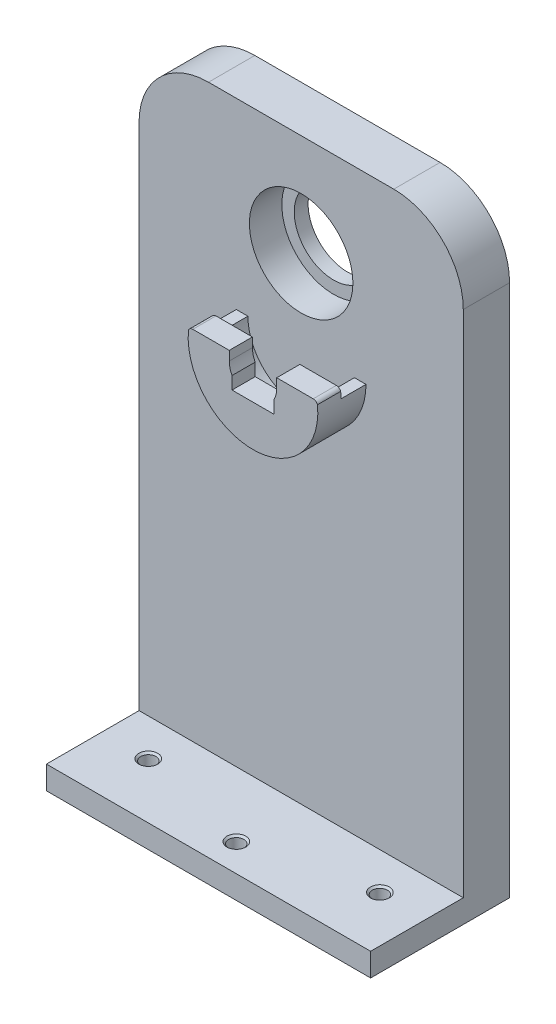
ISO-10303-21;
HEADER;
FILE_DESCRIPTION(('STEP AP214'),'2;1');
FILE_NAME('part.step','',(''),(''),'','','');
FILE_SCHEMA(('AUTOMOTIVE_DESIGN { 1 0 10303 214 1 1 1 1 }'));
ENDSEC;
DATA;
#1=APPLICATION_CONTEXT('core data for automotive mechanical design processes');
#2=APPLICATION_PROTOCOL_DEFINITION('international standard','automotive_design',2000,#1);
#3=PRODUCT_CONTEXT('',#1,'mechanical');
#4=PRODUCT('Part','Part','',(#3));
#5=PRODUCT_RELATED_PRODUCT_CATEGORY('part','',(#4));
#6=PRODUCT_DEFINITION_FORMATION('','',#4);
#7=PRODUCT_DEFINITION_CONTEXT('part definition',#1,'design');
#8=PRODUCT_DEFINITION('design','',#6,#7);
#9=PRODUCT_DEFINITION_SHAPE('','',#8);
#10=(LENGTH_UNIT() NAMED_UNIT(*) SI_UNIT(.MILLI.,.METRE.));
#11=(NAMED_UNIT(*) PLANE_ANGLE_UNIT() SI_UNIT($,.RADIAN.));
#12=(NAMED_UNIT(*) SI_UNIT($,.STERADIAN.) SOLID_ANGLE_UNIT());
#13=UNCERTAINTY_MEASURE_WITH_UNIT(LENGTH_MEASURE(1.E-05),#10,'distance_accuracy_value','');
#14=(GEOMETRIC_REPRESENTATION_CONTEXT(3) GLOBAL_UNCERTAINTY_ASSIGNED_CONTEXT((#13)) GLOBAL_UNIT_ASSIGNED_CONTEXT((#10,
#11,#12)) REPRESENTATION_CONTEXT('',''));
#15=CARTESIAN_POINT('',(0.,0.,0.));
#16=DIRECTION('',(0.,0.,1.));
#17=DIRECTION('',(1.,0.,0.));
#18=AXIS2_PLACEMENT_3D('',#15,#16,#17);
#19=CARTESIAN_POINT('',(-15.,115.,10.));
#20=DIRECTION('',(0.,0.,1.));
#21=DIRECTION('',(1.,0.,0.));
#22=AXIS2_PLACEMENT_3D('',#19,#20,#21);
#23=PLANE('',#22);
#24=CARTESIAN_POINT('',(-35.,108.,10.));
#25=DIRECTION('',(0.,0.,1.));
#26=DIRECTION('',(1.,0.,0.));
#27=AXIS2_PLACEMENT_3D('',#24,#25,#26);
#28=CIRCLE('',#27,11.175);
#29=CARTESIAN_POINT('',(-23.825,108.,10.));
#30=VERTEX_POINT('',#29);
#31=EDGE_CURVE('E420',#30,#30,#28,.T.);
#32=ORIENTED_EDGE('',*,*,#31,.F.);
#33=EDGE_LOOP('',(#32));
#34=FACE_BOUND('',#33,.T.);
#35=DIRECTION('',(-1.,0.,0.));
#36=VECTOR('',#35,1.);
#37=CARTESIAN_POINT('',(-70.,5.,10.));
#38=LINE('',#37,#36);
#39=CARTESIAN_POINT('',(0.,5.,10.));
#40=VERTEX_POINT('',#39);
#41=CARTESIAN_POINT('',(-70.,5.,10.));
#42=VERTEX_POINT('',#41);
#43=EDGE_CURVE('E394',#40,#42,#38,.T.);
#44=ORIENTED_EDGE('',*,*,#43,.F.);
#45=DIRECTION('',(0.,1.,0.));
#46=VECTOR('',#45,1.);
#47=CARTESIAN_POINT('',(0.,0.,10.));
#48=LINE('',#47,#46);
#49=CARTESIAN_POINT('',(0.,115.,10.));
#50=VERTEX_POINT('',#49);
#51=EDGE_CURVE('E434',#40,#50,#48,.T.);
#52=ORIENTED_EDGE('',*,*,#51,.T.);
#53=CARTESIAN_POINT('',(-15.,115.,10.));
#54=DIRECTION('',(0.,0.,1.));
#55=DIRECTION('',(1.,0.,0.));
#56=AXIS2_PLACEMENT_3D('',#53,#54,#55);
#57=CIRCLE('',#56,15.);
#58=CARTESIAN_POINT('',(-15.0000000000001,130.,10.));
#59=VERTEX_POINT('',#58);
#60=EDGE_CURVE('E437',#50,#59,#57,.T.);
#61=ORIENTED_EDGE('',*,*,#60,.T.);
#62=DIRECTION('',(-1.,0.,0.));
#63=VECTOR('',#62,1.);
#64=CARTESIAN_POINT('',(-15.0000000000001,130.,10.));
#65=LINE('',#64,#63);
#66=CARTESIAN_POINT('',(-54.9999999999999,130.,10.));
#67=VERTEX_POINT('',#66);
#68=EDGE_CURVE('E441',#59,#67,#65,.T.);
#69=ORIENTED_EDGE('',*,*,#68,.T.);
#70=CARTESIAN_POINT('',(-55.,115.,10.));
#71=DIRECTION('',(0.,0.,1.));
#72=DIRECTION('',(1.,0.,0.));
#73=AXIS2_PLACEMENT_3D('',#70,#71,#72);
#74=CIRCLE('',#73,15.);
#75=CARTESIAN_POINT('',(-70.,115.,10.));
#76=VERTEX_POINT('',#75);
#77=EDGE_CURVE('E444',#67,#76,#74,.T.);
#78=ORIENTED_EDGE('',*,*,#77,.T.);
#79=DIRECTION('',(0.,-1.,0.));
#80=VECTOR('',#79,1.);
#81=CARTESIAN_POINT('',(-70.,0.,10.));
#82=LINE('',#81,#80);
#83=EDGE_CURVE('E447',#76,#42,#82,.T.);
#84=ORIENTED_EDGE('',*,*,#83,.T.);
#85=EDGE_LOOP('',(#44,#52,#61,#69,#78,#84));
#86=FACE_BOUND('',#85,.T.);
#87=DIRECTION('',(1.,0.,0.));
#88=VECTOR('',#87,1.);
#89=CARTESIAN_POINT('',(0.,90.5,10.));
#90=LINE('',#89,#88);
#91=CARTESIAN_POINT('',(-49.,90.5,10.));
#92=VERTEX_POINT('',#91);
#93=CARTESIAN_POINT('',(-46.5,90.5,10.));
#94=VERTEX_POINT('',#93);
#95=EDGE_CURVE('E222',#92,#94,#90,.T.);
#96=ORIENTED_EDGE('',*,*,#95,.T.);
#97=CARTESIAN_POINT('',(-35.,90.5,10.));
#98=DIRECTION('',(0.,0.,1.));
#99=DIRECTION('',(1.,0.,0.));
#100=AXIS2_PLACEMENT_3D('',#97,#98,#99);
#101=CIRCLE('',#100,11.5);
#102=CARTESIAN_POINT('',(-23.5,90.5,10.));
#103=VERTEX_POINT('',#102);
#104=EDGE_CURVE('E357',#94,#103,#101,.T.);
#105=ORIENTED_EDGE('',*,*,#104,.T.);
#106=CARTESIAN_POINT('',(-21.,90.5,10.));
#107=VERTEX_POINT('',#106);
#108=EDGE_CURVE('E71',#103,#107,#90,.T.);
#109=ORIENTED_EDGE('',*,*,#108,.T.);
#110=CARTESIAN_POINT('',(-35.,90.5,10.));
#111=DIRECTION('',(0.,0.,1.));
#112=DIRECTION('',(1.,0.,0.));
#113=AXIS2_PLACEMENT_3D('',#110,#111,#112);
#114=CIRCLE('',#113,14.);
#115=EDGE_CURVE('E66',#92,#107,#114,.T.);
#116=ORIENTED_EDGE('',*,*,#115,.F.);
#117=EDGE_LOOP('',(#96,#105,#109,#116));
#118=FACE_BOUND('',#117,.T.);
#119=ADVANCED_FACE('F49',(#34,#86,#118),#23,.T.);
#120=CARTESIAN_POINT('',(-35.,108.,10.));
#121=DIRECTION('',(0.,0.,-1.));
#122=DIRECTION('',(-1.,0.,0.));
#123=AXIS2_PLACEMENT_3D('',#120,#121,#122);
#124=CYLINDRICAL_SURFACE('',#123,8.5);
#125=CARTESIAN_POINT('',(-35.,108.,0.));
#126=DIRECTION('',(0.,0.,1.));
#127=DIRECTION('',(1.,0.,0.));
#128=AXIS2_PLACEMENT_3D('',#125,#126,#127);
#129=CIRCLE('',#128,8.5);
#130=CARTESIAN_POINT('',(-26.5,108.,0.));
#131=VERTEX_POINT('',#130);
#132=EDGE_CURVE('E429',#131,#131,#129,.T.);
#133=ORIENTED_EDGE('',*,*,#132,.F.);
#134=EDGE_LOOP('',(#133));
#135=FACE_BOUND('',#134,.T.);
#136=CARTESIAN_POINT('',(-35.,108.,3.));
#137=DIRECTION('',(0.,0.,1.));
#138=DIRECTION('',(1.,0.,0.));
#139=AXIS2_PLACEMENT_3D('',#136,#137,#138);
#140=CIRCLE('',#139,8.5);
#141=CARTESIAN_POINT('',(-26.5,108.,3.));
#142=VERTEX_POINT('',#141);
#143=EDGE_CURVE('E425',#142,#142,#140,.T.);
#144=ORIENTED_EDGE('',*,*,#143,.T.);
#145=EDGE_LOOP('',(#144));
#146=FACE_BOUND('',#145,.T.);
#147=ADVANCED_FACE('F573',(#135,#146),#124,.F.);
#148=CARTESIAN_POINT('',(-15.,115.,0.));
#149=DIRECTION('',(0.,0.,1.));
#150=DIRECTION('',(1.,0.,0.));
#151=AXIS2_PLACEMENT_3D('',#148,#149,#150);
#152=PLANE('',#151);
#153=DIRECTION('',(0.,1.,0.));
#154=VECTOR('',#153,1.);
#155=CARTESIAN_POINT('',(0.,0.,0.));
#156=LINE('',#155,#154);
#157=CARTESIAN_POINT('',(0.,0.,0.));
#158=VERTEX_POINT('',#157);
#159=CARTESIAN_POINT('',(0.,115.,0.));
#160=VERTEX_POINT('',#159);
#161=EDGE_CURVE('E433',#158,#160,#156,.T.);
#162=ORIENTED_EDGE('',*,*,#161,.F.);
#163=DIRECTION('',(1.,0.,0.));
#164=VECTOR('',#163,1.);
#165=CARTESIAN_POINT('',(0.,0.,0.));
#166=LINE('',#165,#164);
#167=CARTESIAN_POINT('',(-70.,0.,0.));
#168=VERTEX_POINT('',#167);
#169=EDGE_CURVE('E438',#168,#158,#166,.T.);
#170=ORIENTED_EDGE('',*,*,#169,.F.);
#171=DIRECTION('',(0.,-1.,0.));
#172=VECTOR('',#171,1.);
#173=CARTESIAN_POINT('',(-70.,0.,0.));
#174=LINE('',#173,#172);
#175=CARTESIAN_POINT('',(-70.,115.,0.));
#176=VERTEX_POINT('',#175);
#177=EDGE_CURVE('E463',#176,#168,#174,.T.);
#178=ORIENTED_EDGE('',*,*,#177,.F.);
#179=CARTESIAN_POINT('',(-55.,115.,0.));
#180=DIRECTION('',(0.,0.,1.));
#181=DIRECTION('',(1.,0.,0.));
#182=AXIS2_PLACEMENT_3D('',#179,#180,#181);
#183=CIRCLE('',#182,15.);
#184=CARTESIAN_POINT('',(-54.9999999999999,130.,0.));
#185=VERTEX_POINT('',#184);
#186=EDGE_CURVE('E460',#185,#176,#183,.T.);
#187=ORIENTED_EDGE('',*,*,#186,.F.);
#188=DIRECTION('',(-1.,0.,0.));
#189=VECTOR('',#188,1.);
#190=CARTESIAN_POINT('',(-15.0000000000001,130.,0.));
#191=LINE('',#190,#189);
#192=CARTESIAN_POINT('',(-15.0000000000001,130.,0.));
#193=VERTEX_POINT('',#192);
#194=EDGE_CURVE('E457',#193,#185,#191,.T.);
#195=ORIENTED_EDGE('',*,*,#194,.F.);
#196=CARTESIAN_POINT('',(-15.,115.,0.));
#197=DIRECTION('',(0.,0.,1.));
#198=DIRECTION('',(1.,0.,0.));
#199=AXIS2_PLACEMENT_3D('',#196,#197,#198);
#200=CIRCLE('',#199,15.);
#201=EDGE_CURVE('E454',#160,#193,#200,.T.);
#202=ORIENTED_EDGE('',*,*,#201,.F.);
#203=EDGE_LOOP('',(#162,#170,#178,#187,#195,#202));
#204=FACE_BOUND('',#203,.T.);
#205=ORIENTED_EDGE('',*,*,#132,.T.);
#206=EDGE_LOOP('',(#205));
#207=FACE_BOUND('',#206,.T.);
#208=ADVANCED_FACE('F547',(#204,#207),#152,.F.);
#209=CARTESIAN_POINT('',(0.,0.,10.));
#210=DIRECTION('',(-1.,0.,0.));
#211=DIRECTION('',(0.,0.,1.));
#212=AXIS2_PLACEMENT_3D('',#209,#210,#211);
#213=PLANE('',#212);
#214=ORIENTED_EDGE('',*,*,#161,.T.);
#215=DIRECTION('',(0.,0.,-1.));
#216=VECTOR('',#215,1.);
#217=CARTESIAN_POINT('',(0.,115.,10.));
#218=LINE('',#217,#216);
#219=EDGE_CURVE('E487',#50,#160,#218,.T.);
#220=ORIENTED_EDGE('',*,*,#219,.F.);
#221=ORIENTED_EDGE('',*,*,#51,.F.);
#222=DIRECTION('',(0.,0.,-1.));
#223=VECTOR('',#222,1.);
#224=CARTESIAN_POINT('',(0.,5.,30.));
#225=LINE('',#224,#223);
#226=CARTESIAN_POINT('',(0.,5.,30.));
#227=VERTEX_POINT('',#226);
#228=EDGE_CURVE('E416',#227,#40,#225,.T.);
#229=ORIENTED_EDGE('',*,*,#228,.F.);
#230=DIRECTION('',(0.,1.,0.));
#231=VECTOR('',#230,1.);
#232=CARTESIAN_POINT('',(0.,0.,30.));
#233=LINE('',#232,#231);
#234=CARTESIAN_POINT('',(0.,0.,30.));
#235=VERTEX_POINT('',#234);
#236=EDGE_CURVE('E403',#235,#227,#233,.T.);
#237=ORIENTED_EDGE('',*,*,#236,.F.);
#238=DIRECTION('',(0.,0.,-1.));
#239=VECTOR('',#238,1.);
#240=CARTESIAN_POINT('',(0.,0.,10.));
#241=LINE('',#240,#239);
#242=EDGE_CURVE('E450',#235,#158,#241,.T.);
#243=ORIENTED_EDGE('',*,*,#242,.T.);
#244=EDGE_LOOP('',(#214,#220,#221,#229,#237,#243));
#245=FACE_BOUND('',#244,.T.);
#246=ADVANCED_FACE('F544',(#245),#213,.F.);
#247=CARTESIAN_POINT('',(-15.,115.,10.));
#248=DIRECTION('',(0.,0.,-1.));
#249=DIRECTION('',(-1.,0.,0.));
#250=AXIS2_PLACEMENT_3D('',#247,#248,#249);
#251=CYLINDRICAL_SURFACE('',#250,15.);
#252=ORIENTED_EDGE('',*,*,#201,.T.);
#253=DIRECTION('',(0.,0.,-1.));
#254=VECTOR('',#253,1.);
#255=CARTESIAN_POINT('',(-15.0000000000001,130.,10.));
#256=LINE('',#255,#254);
#257=EDGE_CURVE('E483',#59,#193,#256,.T.);
#258=ORIENTED_EDGE('',*,*,#257,.F.);
#259=ORIENTED_EDGE('',*,*,#60,.F.);
#260=ORIENTED_EDGE('',*,*,#219,.T.);
#261=EDGE_LOOP('',(#252,#258,#259,#260));
#262=FACE_BOUND('',#261,.T.);
#263=ADVANCED_FACE('F554',(#262),#251,.T.);
#264=CARTESIAN_POINT('',(-15.0000000000001,130.,10.));
#265=DIRECTION('',(0.,-1.,0.));
#266=DIRECTION('',(1.,0.,0.));
#267=AXIS2_PLACEMENT_3D('',#264,#265,#266);
#268=PLANE('',#267);
#269=ORIENTED_EDGE('',*,*,#194,.T.);
#270=DIRECTION('',(0.,0.,-1.));
#271=VECTOR('',#270,1.);
#272=CARTESIAN_POINT('',(-54.9999999999999,130.,10.));
#273=LINE('',#272,#271);
#274=EDGE_CURVE('E479',#67,#185,#273,.T.);
#275=ORIENTED_EDGE('',*,*,#274,.F.);
#276=ORIENTED_EDGE('',*,*,#68,.F.);
#277=ORIENTED_EDGE('',*,*,#257,.T.);
#278=EDGE_LOOP('',(#269,#275,#276,#277));
#279=FACE_BOUND('',#278,.T.);
#280=ADVANCED_FACE('F571',(#279),#268,.F.);
#281=CARTESIAN_POINT('',(-55.,115.,10.));
#282=DIRECTION('',(0.,0.,-1.));
#283=DIRECTION('',(-1.,0.,0.));
#284=AXIS2_PLACEMENT_3D('',#281,#282,#283);
#285=CYLINDRICAL_SURFACE('',#284,15.);
#286=ORIENTED_EDGE('',*,*,#186,.T.);
#287=DIRECTION('',(0.,0.,-1.));
#288=VECTOR('',#287,1.);
#289=CARTESIAN_POINT('',(-70.,115.,10.));
#290=LINE('',#289,#288);
#291=EDGE_CURVE('E475',#76,#176,#290,.T.);
#292=ORIENTED_EDGE('',*,*,#291,.F.);
#293=ORIENTED_EDGE('',*,*,#77,.F.);
#294=ORIENTED_EDGE('',*,*,#274,.T.);
#295=EDGE_LOOP('',(#286,#292,#293,#294));
#296=FACE_BOUND('',#295,.T.);
#297=ADVANCED_FACE('F566',(#296),#285,.T.);
#298=CARTESIAN_POINT('',(-70.,0.,10.));
#299=DIRECTION('',(1.,0.,0.));
#300=DIRECTION('',(0.,0.,-1.));
#301=AXIS2_PLACEMENT_3D('',#298,#299,#300);
#302=PLANE('',#301);
#303=ORIENTED_EDGE('',*,*,#177,.T.);
#304=DIRECTION('',(0.,0.,-1.));
#305=VECTOR('',#304,1.);
#306=CARTESIAN_POINT('',(-70.,0.,10.));
#307=LINE('',#306,#305);
#308=CARTESIAN_POINT('',(-70.,0.,30.));
#309=VERTEX_POINT('',#308);
#310=EDGE_CURVE('E471',#309,#168,#307,.T.);
#311=ORIENTED_EDGE('',*,*,#310,.F.);
#312=DIRECTION('',(0.,-1.,0.));
#313=VECTOR('',#312,1.);
#314=CARTESIAN_POINT('',(-70.,0.,30.));
#315=LINE('',#314,#313);
#316=CARTESIAN_POINT('',(-70.,5.,30.));
#317=VERTEX_POINT('',#316);
#318=EDGE_CURVE('E395',#317,#309,#315,.T.);
#319=ORIENTED_EDGE('',*,*,#318,.F.);
#320=DIRECTION('',(0.,0.,-1.));
#321=VECTOR('',#320,1.);
#322=CARTESIAN_POINT('',(-70.,5.,30.));
#323=LINE('',#322,#321);
#324=EDGE_CURVE('E409',#317,#42,#323,.T.);
#325=ORIENTED_EDGE('',*,*,#324,.T.);
#326=ORIENTED_EDGE('',*,*,#83,.F.);
#327=ORIENTED_EDGE('',*,*,#291,.T.);
#328=EDGE_LOOP('',(#303,#311,#319,#325,#326,#327));
#329=FACE_BOUND('',#328,.T.);
#330=ADVANCED_FACE('F534',(#329),#302,.F.);
#331=CARTESIAN_POINT('',(0.,0.,10.));
#332=DIRECTION('',(0.,1.,0.));
#333=DIRECTION('',(-1.,0.,0.));
#334=AXIS2_PLACEMENT_3D('',#331,#332,#333);
#335=PLANE('',#334);
#336=CARTESIAN_POINT('',(-60.,0.,18.));
#337=DIRECTION('',(0.,1.,0.));
#338=DIRECTION('',(-1.,0.,0.));
#339=AXIS2_PLACEMENT_3D('',#336,#337,#338);
#340=CIRCLE('',#339,1.64000000000001);
#341=CARTESIAN_POINT('',(-61.64,0.,18.));
#342=VERTEX_POINT('',#341);
#343=EDGE_CURVE('E390',#342,#342,#340,.T.);
#344=ORIENTED_EDGE('',*,*,#343,.T.);
#345=EDGE_LOOP('',(#344));
#346=FACE_BOUND('',#345,.T.);
#347=CARTESIAN_POINT('',(-35.,0.,24.));
#348=DIRECTION('',(0.,1.,0.));
#349=DIRECTION('',(-1.,0.,0.));
#350=AXIS2_PLACEMENT_3D('',#347,#348,#349);
#351=CIRCLE('',#350,1.64000000000001);
#352=CARTESIAN_POINT('',(-36.64,0.,24.));
#353=VERTEX_POINT('',#352);
#354=EDGE_CURVE('E386',#353,#353,#351,.T.);
#355=ORIENTED_EDGE('',*,*,#354,.T.);
#356=EDGE_LOOP('',(#355));
#357=FACE_BOUND('',#356,.T.);
#358=CARTESIAN_POINT('',(-10.,0.,18.));
#359=DIRECTION('',(0.,1.,0.));
#360=DIRECTION('',(-1.,0.,0.));
#361=AXIS2_PLACEMENT_3D('',#358,#359,#360);
#362=CIRCLE('',#361,1.64);
#363=CARTESIAN_POINT('',(-11.64,0.,18.));
#364=VERTEX_POINT('',#363);
#365=EDGE_CURVE('E382',#364,#364,#362,.T.);
#366=ORIENTED_EDGE('',*,*,#365,.T.);
#367=EDGE_LOOP('',(#366));
#368=FACE_BOUND('',#367,.T.);
#369=ORIENTED_EDGE('',*,*,#169,.T.);
#370=ORIENTED_EDGE('',*,*,#242,.F.);
#371=DIRECTION('',(1.,0.,0.));
#372=VECTOR('',#371,1.);
#373=CARTESIAN_POINT('',(-70.,0.,30.));
#374=LINE('',#373,#372);
#375=EDGE_CURVE('E399',#309,#235,#374,.T.);
#376=ORIENTED_EDGE('',*,*,#375,.F.);
#377=ORIENTED_EDGE('',*,*,#310,.T.);
#378=EDGE_LOOP('',(#369,#370,#376,#377));
#379=FACE_BOUND('',#378,.T.);
#380=ADVANCED_FACE('F530',(#346,#357,#368,#379),#335,.F.);
#381=CARTESIAN_POINT('',(-35.,108.,3.));
#382=DIRECTION('',(0.,0.,1.));
#383=DIRECTION('',(1.,0.,0.));
#384=AXIS2_PLACEMENT_3D('',#381,#382,#383);
#385=CYLINDRICAL_SURFACE('',#384,11.175);
#386=CARTESIAN_POINT('',(-35.,108.,3.));
#387=DIRECTION('',(0.,0.,1.));
#388=DIRECTION('',(1.,0.,0.));
#389=AXIS2_PLACEMENT_3D('',#386,#387,#388);
#390=CIRCLE('',#389,11.175);
#391=CARTESIAN_POINT('',(-23.825,108.,3.));
#392=VERTEX_POINT('',#391);
#393=EDGE_CURVE('E421',#392,#392,#390,.T.);
#394=ORIENTED_EDGE('',*,*,#393,.F.);
#395=EDGE_LOOP('',(#394));
#396=FACE_BOUND('',#395,.T.);
#397=ORIENTED_EDGE('',*,*,#31,.T.);
#398=EDGE_LOOP('',(#397));
#399=FACE_BOUND('',#398,.T.);
#400=ADVANCED_FACE('F533',(#396,#399),#385,.F.);
#401=CARTESIAN_POINT('',(-35.,108.,3.));
#402=DIRECTION('',(0.,0.,1.));
#403=DIRECTION('',(1.,0.,0.));
#404=AXIS2_PLACEMENT_3D('',#401,#402,#403);
#405=PLANE('',#404);
#406=ORIENTED_EDGE('',*,*,#143,.F.);
#407=EDGE_LOOP('',(#406));
#408=FACE_BOUND('',#407,.T.);
#409=ORIENTED_EDGE('',*,*,#393,.T.);
#410=EDGE_LOOP('',(#409));
#411=FACE_BOUND('',#410,.T.);
#412=ADVANCED_FACE('F663',(#408,#411),#405,.T.);
#413=CARTESIAN_POINT('',(-70.,5.,30.));
#414=DIRECTION('',(0.,-1.,0.));
#415=DIRECTION('',(0.,0.,-1.));
#416=AXIS2_PLACEMENT_3D('',#413,#414,#415);
#417=PLANE('',#416);
#418=CARTESIAN_POINT('',(-10.,5.,18.));
#419=DIRECTION('',(0.,-1.,0.));
#420=DIRECTION('',(0.,0.,-1.));
#421=AXIS2_PLACEMENT_3D('',#418,#419,#420);
#422=CIRCLE('',#421,2.04);
#423=CARTESIAN_POINT('',(-10.,5.,15.96));
#424=VERTEX_POINT('',#423);
#425=EDGE_CURVE('E59',#424,#424,#422,.T.);
#426=ORIENTED_EDGE('',*,*,#425,.T.);
#427=EDGE_LOOP('',(#426));
#428=FACE_BOUND('',#427,.T.);
#429=CARTESIAN_POINT('',(-60.,5.,18.));
#430=DIRECTION('',(0.,-1.,0.));
#431=DIRECTION('',(0.,0.,-1.));
#432=AXIS2_PLACEMENT_3D('',#429,#430,#431);
#433=CIRCLE('',#432,2.04);
#434=CARTESIAN_POINT('',(-60.,5.,15.96));
#435=VERTEX_POINT('',#434);
#436=EDGE_CURVE('E506',#435,#435,#433,.T.);
#437=ORIENTED_EDGE('',*,*,#436,.T.);
#438=EDGE_LOOP('',(#437));
#439=FACE_BOUND('',#438,.T.);
#440=CARTESIAN_POINT('',(-35.,5.,24.));
#441=DIRECTION('',(0.,-1.,0.));
#442=DIRECTION('',(0.,0.,-1.));
#443=AXIS2_PLACEMENT_3D('',#440,#441,#442);
#444=CIRCLE('',#443,2.04);
#445=CARTESIAN_POINT('',(-35.,5.,21.96));
#446=VERTEX_POINT('',#445);
#447=EDGE_CURVE('E498',#446,#446,#444,.T.);
#448=ORIENTED_EDGE('',*,*,#447,.T.);
#449=EDGE_LOOP('',(#448));
#450=FACE_BOUND('',#449,.T.);
#451=ORIENTED_EDGE('',*,*,#43,.T.);
#452=ORIENTED_EDGE('',*,*,#324,.F.);
#453=DIRECTION('',(-1.,0.,0.));
#454=VECTOR('',#453,1.);
#455=CARTESIAN_POINT('',(-70.,5.,30.));
#456=LINE('',#455,#454);
#457=EDGE_CURVE('E406',#227,#317,#456,.T.);
#458=ORIENTED_EDGE('',*,*,#457,.F.);
#459=ORIENTED_EDGE('',*,*,#228,.T.);
#460=EDGE_LOOP('',(#451,#452,#458,#459));
#461=FACE_BOUND('',#460,.T.);
#462=ADVANCED_FACE('F513',(#428,#439,#450,#461),#417,.F.);
#463=CARTESIAN_POINT('',(0.,0.,30.));
#464=DIRECTION('',(0.,0.,-1.));
#465=DIRECTION('',(-1.,0.,0.));
#466=AXIS2_PLACEMENT_3D('',#463,#464,#465);
#467=PLANE('',#466);
#468=ORIENTED_EDGE('',*,*,#318,.T.);
#469=ORIENTED_EDGE('',*,*,#375,.T.);
#470=ORIENTED_EDGE('',*,*,#236,.T.);
#471=ORIENTED_EDGE('',*,*,#457,.T.);
#472=EDGE_LOOP('',(#468,#469,#470,#471));
#473=FACE_BOUND('',#472,.T.);
#474=ADVANCED_FACE('F526',(#473),#467,.F.);
#475=CARTESIAN_POINT('',(-10.,-15.,18.));
#476=DIRECTION('',(0.,1.,0.));
#477=DIRECTION('',(0.,0.,1.));
#478=AXIS2_PLACEMENT_3D('',#475,#476,#477);
#479=CYLINDRICAL_SURFACE('',#478,1.64);
#480=CARTESIAN_POINT('',(-10.,4.60000000000001,18.));
#481=DIRECTION('',(0.,-1.,0.));
#482=DIRECTION('',(0.,0.,-1.));
#483=AXIS2_PLACEMENT_3D('',#480,#481,#482);
#484=CIRCLE('',#483,1.64);
#485=CARTESIAN_POINT('',(-10.,4.60000000000001,16.36));
#486=VERTEX_POINT('',#485);
#487=EDGE_CURVE('E502',#486,#486,#484,.F.);
#488=ORIENTED_EDGE('',*,*,#487,.T.);
#489=EDGE_LOOP('',(#488));
#490=FACE_BOUND('',#489,.T.);
#491=ORIENTED_EDGE('',*,*,#365,.F.);
#492=EDGE_LOOP('',(#491));
#493=FACE_BOUND('',#492,.T.);
#494=ADVANCED_FACE('F522',(#490,#493),#479,.F.);
#495=CARTESIAN_POINT('',(-35.,-15.,24.));
#496=DIRECTION('',(0.,1.,0.));
#497=DIRECTION('',(0.,0.,1.));
#498=AXIS2_PLACEMENT_3D('',#495,#496,#497);
#499=CYLINDRICAL_SURFACE('',#498,1.64000000000001);
#500=CARTESIAN_POINT('',(-35.,4.60000000000001,24.));
#501=DIRECTION('',(0.,-1.,0.));
#502=DIRECTION('',(0.,0.,-1.));
#503=AXIS2_PLACEMENT_3D('',#500,#501,#502);
#504=CIRCLE('',#503,1.64000000000001);
#505=CARTESIAN_POINT('',(-35.,4.60000000000001,22.36));
#506=VERTEX_POINT('',#505);
#507=EDGE_CURVE('E491',#506,#506,#504,.F.);
#508=ORIENTED_EDGE('',*,*,#507,.T.);
#509=EDGE_LOOP('',(#508));
#510=FACE_BOUND('',#509,.T.);
#511=ORIENTED_EDGE('',*,*,#354,.F.);
#512=EDGE_LOOP('',(#511));
#513=FACE_BOUND('',#512,.T.);
#514=ADVANCED_FACE('F525',(#510,#513),#499,.F.);
#515=CARTESIAN_POINT('',(-60.,-15.,18.));
#516=DIRECTION('',(0.,1.,0.));
#517=DIRECTION('',(0.,0.,1.));
#518=AXIS2_PLACEMENT_3D('',#515,#516,#517);
#519=CYLINDRICAL_SURFACE('',#518,1.64000000000001);
#520=CARTESIAN_POINT('',(-60.,4.60000000000001,18.));
#521=DIRECTION('',(0.,-1.,0.));
#522=DIRECTION('',(0.,0.,-1.));
#523=AXIS2_PLACEMENT_3D('',#520,#521,#522);
#524=CIRCLE('',#523,1.64000000000001);
#525=CARTESIAN_POINT('',(-60.,4.60000000000001,16.36));
#526=VERTEX_POINT('',#525);
#527=EDGE_CURVE('E11',#526,#526,#524,.F.);
#528=ORIENTED_EDGE('',*,*,#527,.T.);
#529=EDGE_LOOP('',(#528));
#530=FACE_BOUND('',#529,.T.);
#531=ORIENTED_EDGE('',*,*,#343,.F.);
#532=EDGE_LOOP('',(#531));
#533=FACE_BOUND('',#532,.T.);
#534=ADVANCED_FACE('F652',(#530,#533),#519,.F.);
#535=CARTESIAN_POINT('',(-35.,4.60000000000001,24.));
#536=DIRECTION('',(0.,1.,0.));
#537=DIRECTION('',(0.,0.,1.));
#538=AXIS2_PLACEMENT_3D('',#535,#536,#537);
#539=CONICAL_SURFACE('',#538,1.64000000000001,0.785398163397453);
#540=ORIENTED_EDGE('',*,*,#447,.F.);
#541=EDGE_LOOP('',(#540));
#542=FACE_BOUND('',#541,.T.);
#543=ORIENTED_EDGE('',*,*,#507,.F.);
#544=EDGE_LOOP('',(#543));
#545=FACE_BOUND('',#544,.T.);
#546=ADVANCED_FACE('F519',(#542,#545),#539,.F.);
#547=CARTESIAN_POINT('',(-10.,4.60000000000001,18.));
#548=DIRECTION('',(0.,1.,0.));
#549=DIRECTION('',(0.,0.,1.));
#550=AXIS2_PLACEMENT_3D('',#547,#548,#549);
#551=CONICAL_SURFACE('',#550,1.64,0.785398163397457);
#552=ORIENTED_EDGE('',*,*,#425,.F.);
#553=EDGE_LOOP('',(#552));
#554=FACE_BOUND('',#553,.T.);
#555=ORIENTED_EDGE('',*,*,#487,.F.);
#556=EDGE_LOOP('',(#555));
#557=FACE_BOUND('',#556,.T.);
#558=ADVANCED_FACE('F516',(#554,#557),#551,.F.);
#559=CARTESIAN_POINT('',(-60.,4.60000000000001,18.));
#560=DIRECTION('',(0.,1.,0.));
#561=DIRECTION('',(0.,0.,1.));
#562=AXIS2_PLACEMENT_3D('',#559,#560,#561);
#563=CONICAL_SURFACE('',#562,1.64000000000001,0.785398163397453);
#564=ORIENTED_EDGE('',*,*,#436,.F.);
#565=EDGE_LOOP('',(#564));
#566=FACE_BOUND('',#565,.T.);
#567=ORIENTED_EDGE('',*,*,#527,.F.);
#568=EDGE_LOOP('',(#567));
#569=FACE_BOUND('',#568,.T.);
#570=ADVANCED_FACE('F52',(#566,#569),#563,.F.);
#571=CARTESIAN_POINT('',(0.,90.5,15.4));
#572=DIRECTION('',(0.,1.,0.));
#573=DIRECTION('',(0.,0.,1.));
#574=AXIS2_PLACEMENT_3D('',#571,#572,#573);
#575=PLANE('',#574);
#576=ORIENTED_EDGE('',*,*,#95,.F.);
#577=DIRECTION('',(0.,0.,-1.));
#578=VECTOR('',#577,1.);
#579=CARTESIAN_POINT('',(-49.,90.5,15.4));
#580=LINE('',#579,#578);
#581=CARTESIAN_POINT('',(-49.,90.5,15.4));
#582=VERTEX_POINT('',#581);
#583=EDGE_CURVE('E379',#582,#92,#580,.T.);
#584=ORIENTED_EDGE('',*,*,#583,.F.);
#585=DIRECTION('',(1.,0.,0.));
#586=VECTOR('',#585,1.);
#587=CARTESIAN_POINT('',(0.,90.5,15.4));
#588=LINE('',#587,#586);
#589=CARTESIAN_POINT('',(-46.5,90.5,15.4));
#590=VERTEX_POINT('',#589);
#591=EDGE_CURVE('E352',#582,#590,#588,.T.);
#592=ORIENTED_EDGE('',*,*,#591,.T.);
#593=DIRECTION('',(0.,0.,-1.));
#594=VECTOR('',#593,1.);
#595=CARTESIAN_POINT('',(-46.5,90.5,15.4));
#596=LINE('',#595,#594);
#597=EDGE_CURVE('E362',#590,#94,#596,.T.);
#598=ORIENTED_EDGE('',*,*,#597,.T.);
#599=EDGE_LOOP('',(#576,#584,#592,#598));
#600=FACE_BOUND('',#599,.T.);
#601=ADVANCED_FACE('F581',(#600),#575,.T.);
#602=CARTESIAN_POINT('',(-35.,90.5,15.4));
#603=DIRECTION('',(0.,0.,-1.));
#604=DIRECTION('',(-1.,0.,0.));
#605=AXIS2_PLACEMENT_3D('',#602,#603,#604);
#606=CYLINDRICAL_SURFACE('',#605,14.);
#607=ORIENTED_EDGE('',*,*,#115,.T.);
#608=DIRECTION('',(0.,0.,-1.));
#609=VECTOR('',#608,1.);
#610=CARTESIAN_POINT('',(-21.,90.5,15.4));
#611=LINE('',#610,#609);
#612=CARTESIAN_POINT('',(-21.,90.5,15.4));
#613=VERTEX_POINT('',#612);
#614=EDGE_CURVE('E376',#613,#107,#611,.T.);
#615=ORIENTED_EDGE('',*,*,#614,.F.);
#616=CARTESIAN_POINT('',(-35.,90.5,15.4));
#617=DIRECTION('',(0.,0.,1.));
#618=DIRECTION('',(1.,0.,0.));
#619=AXIS2_PLACEMENT_3D('',#616,#617,#618);
#620=CIRCLE('',#619,14.);
#621=CARTESIAN_POINT('',(-21.0659299955503,91.8570899421537,15.4));
#622=VERTEX_POINT('',#621);
#623=EDGE_CURVE('E308',#613,#622,#620,.T.);
#624=ORIENTED_EDGE('',*,*,#623,.T.);
#625=DIRECTION('',(0.,0.,-1.));
#626=VECTOR('',#625,1.);
#627=CARTESIAN_POINT('',(-21.0659299955503,91.8570899421537,20.4));
#628=LINE('',#627,#626);
#629=CARTESIAN_POINT('',(-21.0659299955503,91.8570899421537,20.4));
#630=VERTEX_POINT('',#629);
#631=EDGE_CURVE('E325',#630,#622,#628,.T.);
#632=ORIENTED_EDGE('',*,*,#631,.F.);
#633=CARTESIAN_POINT('',(-35.,90.5,20.4));
#634=DIRECTION('',(0.,0.,1.));
#635=DIRECTION('',(1.,0.,0.));
#636=AXIS2_PLACEMENT_3D('',#633,#634,#635);
#637=CIRCLE('',#636,14.);
#638=CARTESIAN_POINT('',(-48.9340700044497,91.8570899421537,20.4));
#639=VERTEX_POINT('',#638);
#640=EDGE_CURVE('E269',#639,#630,#637,.T.);
#641=ORIENTED_EDGE('',*,*,#640,.F.);
#642=DIRECTION('',(0.,0.,-1.));
#643=VECTOR('',#642,1.);
#644=CARTESIAN_POINT('',(-48.9340700044497,91.8570899421537,20.4));
#645=LINE('',#644,#643);
#646=CARTESIAN_POINT('',(-48.9340700044497,91.8570899421537,15.4));
#647=VERTEX_POINT('',#646);
#648=EDGE_CURVE('E329',#639,#647,#645,.T.);
#649=ORIENTED_EDGE('',*,*,#648,.T.);
#650=EDGE_CURVE('E309',#647,#582,#620,.T.);
#651=ORIENTED_EDGE('',*,*,#650,.T.);
#652=ORIENTED_EDGE('',*,*,#583,.T.);
#653=EDGE_LOOP('',(#607,#615,#624,#632,#641,#649,#651,#652));
#654=FACE_BOUND('',#653,.T.);
#655=ADVANCED_FACE('F598',(#654),#606,.T.);
#656=ORIENTED_EDGE('',*,*,#108,.F.);
#657=DIRECTION('',(0.,0.,-1.));
#658=VECTOR('',#657,1.);
#659=CARTESIAN_POINT('',(-23.5,90.5,15.4));
#660=LINE('',#659,#658);
#661=CARTESIAN_POINT('',(-23.5,90.5,15.4));
#662=VERTEX_POINT('',#661);
#663=EDGE_CURVE('E372',#662,#103,#660,.T.);
#664=ORIENTED_EDGE('',*,*,#663,.F.);
#665=EDGE_CURVE('E356',#662,#613,#588,.T.);
#666=ORIENTED_EDGE('',*,*,#665,.T.);
#667=ORIENTED_EDGE('',*,*,#614,.T.);
#668=EDGE_LOOP('',(#656,#664,#666,#667));
#669=FACE_BOUND('',#668,.T.);
#670=ADVANCED_FACE('F587',(#669),#575,.T.);
#671=CARTESIAN_POINT('',(-35.,90.5,15.4));
#672=DIRECTION('',(0.,0.,-1.));
#673=DIRECTION('',(-1.,0.,0.));
#674=AXIS2_PLACEMENT_3D('',#671,#672,#673);
#675=CYLINDRICAL_SURFACE('',#674,11.5);
#676=ORIENTED_EDGE('',*,*,#104,.F.);
#677=ORIENTED_EDGE('',*,*,#597,.F.);
#678=CARTESIAN_POINT('',(-35.,90.5,15.4));
#679=DIRECTION('',(0.,0.,1.));
#680=DIRECTION('',(1.,0.,0.));
#681=AXIS2_PLACEMENT_3D('',#678,#679,#680);
#682=CIRCLE('',#681,11.5);
#683=EDGE_CURVE('E358',#590,#662,#682,.T.);
#684=ORIENTED_EDGE('',*,*,#683,.T.);
#685=ORIENTED_EDGE('',*,*,#663,.T.);
#686=EDGE_LOOP('',(#676,#677,#684,#685));
#687=FACE_BOUND('',#686,.T.);
#688=ADVANCED_FACE('F583',(#687),#675,.F.);
#689=CARTESIAN_POINT('',(0.,0.,15.4));
#690=DIRECTION('',(0.,0.,1.));
#691=DIRECTION('',(1.,0.,0.));
#692=AXIS2_PLACEMENT_3D('',#689,#690,#691);
#693=PLANE('',#692);
#694=ORIENTED_EDGE('',*,*,#591,.F.);
#695=ORIENTED_EDGE('',*,*,#650,.F.);
#696=CARTESIAN_POINT('',(-48.,91.5,15.4));
#697=DIRECTION('',(0.,0.,1.));
#698=DIRECTION('',(1.,0.,0.));
#699=AXIS2_PLACEMENT_3D('',#696,#697,#698);
#700=CIRCLE('',#699,1.);
#701=CARTESIAN_POINT('',(-48.,92.5,15.4));
#702=VERTEX_POINT('',#701);
#703=EDGE_CURVE('E304',#647,#702,#700,.F.);
#704=ORIENTED_EDGE('',*,*,#703,.T.);
#705=DIRECTION('',(1.,0.,0.));
#706=VECTOR('',#705,1.);
#707=CARTESIAN_POINT('',(0.,92.5,15.4));
#708=LINE('',#707,#706);
#709=CARTESIAN_POINT('',(-40.125,92.5,15.4));
#710=VERTEX_POINT('',#709);
#711=EDGE_CURVE('E300',#702,#710,#708,.T.);
#712=ORIENTED_EDGE('',*,*,#711,.T.);
#713=DIRECTION('',(0.,1.,0.));
#714=VECTOR('',#713,1.);
#715=CARTESIAN_POINT('',(-40.125,0.,15.4));
#716=LINE('',#715,#714);
#717=CARTESIAN_POINT('',(-40.125,90.5,15.4));
#718=VERTEX_POINT('',#717);
#719=EDGE_CURVE('E296',#718,#710,#716,.T.);
#720=ORIENTED_EDGE('',*,*,#719,.F.);
#721=CARTESIAN_POINT('',(-35.,90.5,15.4));
#722=DIRECTION('',(0.,0.,1.));
#723=DIRECTION('',(1.,0.,0.));
#724=AXIS2_PLACEMENT_3D('',#721,#722,#723);
#725=CIRCLE('',#724,5.125);
#726=CARTESIAN_POINT('',(-39.525,88.0937581168968,15.4));
#727=VERTEX_POINT('',#726);
#728=EDGE_CURVE('E284',#718,#727,#725,.T.);
#729=ORIENTED_EDGE('',*,*,#728,.T.);
#730=DIRECTION('',(0.,-1.,0.));
#731=VECTOR('',#730,1.);
#732=CARTESIAN_POINT('',(-39.525,0.,15.4));
#733=LINE('',#732,#731);
#734=CARTESIAN_POINT('',(-39.525,85.375,15.4));
#735=VERTEX_POINT('',#734);
#736=EDGE_CURVE('E292',#727,#735,#733,.T.);
#737=ORIENTED_EDGE('',*,*,#736,.T.);
#738=DIRECTION('',(1.,0.,0.));
#739=VECTOR('',#738,1.);
#740=CARTESIAN_POINT('',(0.,85.375,15.4));
#741=LINE('',#740,#739);
#742=CARTESIAN_POINT('',(-30.475,85.375,15.4));
#743=VERTEX_POINT('',#742);
#744=EDGE_CURVE('E288',#735,#743,#741,.T.);
#745=ORIENTED_EDGE('',*,*,#744,.T.);
#746=DIRECTION('',(0.,-1.,0.));
#747=VECTOR('',#746,1.);
#748=CARTESIAN_POINT('',(-30.475,0.,15.4));
#749=LINE('',#748,#747);
#750=CARTESIAN_POINT('',(-30.475,88.0937581168968,15.4));
#751=VERTEX_POINT('',#750);
#752=EDGE_CURVE('E283',#751,#743,#749,.T.);
#753=ORIENTED_EDGE('',*,*,#752,.F.);
#754=CARTESIAN_POINT('',(-29.875,90.5,15.4));
#755=VERTEX_POINT('',#754);
#756=EDGE_CURVE('E280',#751,#755,#725,.T.);
#757=ORIENTED_EDGE('',*,*,#756,.T.);
#758=DIRECTION('',(0.,1.,0.));
#759=VECTOR('',#758,1.);
#760=CARTESIAN_POINT('',(-29.875,0.,15.4));
#761=LINE('',#760,#759);
#762=CARTESIAN_POINT('',(-29.875,92.5,15.4));
#763=VERTEX_POINT('',#762);
#764=EDGE_CURVE('E216',#755,#763,#761,.T.);
#765=ORIENTED_EDGE('',*,*,#764,.T.);
#766=DIRECTION('',(-1.,0.,0.));
#767=VECTOR('',#766,1.);
#768=CARTESIAN_POINT('',(0.,92.5,15.4));
#769=LINE('',#768,#767);
#770=CARTESIAN_POINT('',(-22.,92.5,15.4));
#771=VERTEX_POINT('',#770);
#772=EDGE_CURVE('E233',#771,#763,#769,.T.);
#773=ORIENTED_EDGE('',*,*,#772,.F.);
#774=CARTESIAN_POINT('',(-22.,91.5,15.4));
#775=DIRECTION('',(0.,0.,1.));
#776=DIRECTION('',(1.,0.,0.));
#777=AXIS2_PLACEMENT_3D('',#774,#775,#776);
#778=CIRCLE('',#777,1.);
#779=EDGE_CURVE('E313',#622,#771,#778,.T.);
#780=ORIENTED_EDGE('',*,*,#779,.F.);
#781=ORIENTED_EDGE('',*,*,#623,.F.);
#782=ORIENTED_EDGE('',*,*,#665,.F.);
#783=ORIENTED_EDGE('',*,*,#683,.F.);
#784=EDGE_LOOP('',(#694,#695,#704,#712,#720,#729,#737,#745,#753,#757,#765,#773,#780,#781,#782,#783));
#785=FACE_BOUND('',#784,.T.);
#786=ADVANCED_FACE('F592',(#785),#693,.F.);
#787=CARTESIAN_POINT('',(-29.875,0.,20.4));
#788=DIRECTION('',(-1.,0.,0.));
#789=DIRECTION('',(0.,0.,1.));
#790=AXIS2_PLACEMENT_3D('',#787,#788,#789);
#791=PLANE('',#790);
#792=ORIENTED_EDGE('',*,*,#764,.F.);
#793=DIRECTION('',(0.,0.,-1.));
#794=VECTOR('',#793,1.);
#795=CARTESIAN_POINT('',(-29.875,90.5,20.4));
#796=LINE('',#795,#794);
#797=CARTESIAN_POINT('',(-29.875,90.5,20.4));
#798=VERTEX_POINT('',#797);
#799=EDGE_CURVE('E211',#798,#755,#796,.T.);
#800=ORIENTED_EDGE('',*,*,#799,.F.);
#801=DIRECTION('',(0.,1.,0.));
#802=VECTOR('',#801,1.);
#803=CARTESIAN_POINT('',(-29.875,0.,20.4));
#804=LINE('',#803,#802);
#805=CARTESIAN_POINT('',(-29.875,92.5,20.4));
#806=VERTEX_POINT('',#805);
#807=EDGE_CURVE('E214',#798,#806,#804,.T.);
#808=ORIENTED_EDGE('',*,*,#807,.T.);
#809=DIRECTION('',(0.,0.,-1.));
#810=VECTOR('',#809,1.);
#811=CARTESIAN_POINT('',(-29.875,92.5,20.4));
#812=LINE('',#811,#810);
#813=EDGE_CURVE('E277',#806,#763,#812,.T.);
#814=ORIENTED_EDGE('',*,*,#813,.T.);
#815=EDGE_LOOP('',(#792,#800,#808,#814));
#816=FACE_BOUND('',#815,.T.);
#817=ADVANCED_FACE('F213',(#816),#791,.T.);
#818=CARTESIAN_POINT('',(-35.,90.5,20.4));
#819=DIRECTION('',(0.,0.,-1.));
#820=DIRECTION('',(-1.,0.,0.));
#821=AXIS2_PLACEMENT_3D('',#818,#819,#820);
#822=CYLINDRICAL_SURFACE('',#821,5.125);
#823=ORIENTED_EDGE('',*,*,#756,.F.);
#824=DIRECTION('',(0.,0.,-1.));
#825=VECTOR('',#824,1.);
#826=CARTESIAN_POINT('',(-30.475,88.0937581168968,20.4));
#827=LINE('',#826,#825);
#828=CARTESIAN_POINT('',(-30.475,88.0937581168968,20.4));
#829=VERTEX_POINT('',#828);
#830=EDGE_CURVE('E223',#829,#751,#827,.T.);
#831=ORIENTED_EDGE('',*,*,#830,.F.);
#832=CARTESIAN_POINT('',(-35.,90.5,20.4));
#833=DIRECTION('',(0.,0.,1.));
#834=DIRECTION('',(1.,0.,0.));
#835=AXIS2_PLACEMENT_3D('',#832,#833,#834);
#836=CIRCLE('',#835,5.125);
#837=EDGE_CURVE('E228',#829,#798,#836,.T.);
#838=ORIENTED_EDGE('',*,*,#837,.T.);
#839=ORIENTED_EDGE('',*,*,#799,.T.);
#840=EDGE_LOOP('',(#823,#831,#838,#839));
#841=FACE_BOUND('',#840,.T.);
#842=ADVANCED_FACE('F235',(#841),#822,.F.);
#843=CARTESIAN_POINT('',(-30.475,0.,20.4));
#844=DIRECTION('',(1.,0.,0.));
#845=DIRECTION('',(0.,0.,-1.));
#846=AXIS2_PLACEMENT_3D('',#843,#844,#845);
#847=PLANE('',#846);
#848=ORIENTED_EDGE('',*,*,#752,.T.);
#849=DIRECTION('',(0.,0.,-1.));
#850=VECTOR('',#849,1.);
#851=CARTESIAN_POINT('',(-30.475,85.375,20.4));
#852=LINE('',#851,#850);
#853=CARTESIAN_POINT('',(-30.475,85.375,20.4));
#854=VERTEX_POINT('',#853);
#855=EDGE_CURVE('E347',#854,#743,#852,.T.);
#856=ORIENTED_EDGE('',*,*,#855,.F.);
#857=DIRECTION('',(0.,-1.,0.));
#858=VECTOR('',#857,1.);
#859=CARTESIAN_POINT('',(-30.475,0.,20.4));
#860=LINE('',#859,#858);
#861=EDGE_CURVE('E238',#829,#854,#860,.T.);
#862=ORIENTED_EDGE('',*,*,#861,.F.);
#863=ORIENTED_EDGE('',*,*,#830,.T.);
#864=EDGE_LOOP('',(#848,#856,#862,#863));
#865=FACE_BOUND('',#864,.T.);
#866=ADVANCED_FACE('F626',(#865),#847,.F.);
#867=CARTESIAN_POINT('',(0.,85.375,20.4));
#868=DIRECTION('',(0.,1.,0.));
#869=DIRECTION('',(0.,0.,1.));
#870=AXIS2_PLACEMENT_3D('',#867,#868,#869);
#871=PLANE('',#870);
#872=ORIENTED_EDGE('',*,*,#744,.F.);
#873=DIRECTION('',(0.,0.,-1.));
#874=VECTOR('',#873,1.);
#875=CARTESIAN_POINT('',(-39.525,85.375,20.4));
#876=LINE('',#875,#874);
#877=CARTESIAN_POINT('',(-39.525,85.375,20.4));
#878=VERTEX_POINT('',#877);
#879=EDGE_CURVE('E344',#878,#735,#876,.T.);
#880=ORIENTED_EDGE('',*,*,#879,.F.);
#881=DIRECTION('',(1.,0.,0.));
#882=VECTOR('',#881,1.);
#883=CARTESIAN_POINT('',(0.,85.375,20.4));
#884=LINE('',#883,#882);
#885=EDGE_CURVE('E242',#878,#854,#884,.T.);
#886=ORIENTED_EDGE('',*,*,#885,.T.);
#887=ORIENTED_EDGE('',*,*,#855,.T.);
#888=EDGE_LOOP('',(#872,#880,#886,#887));
#889=FACE_BOUND('',#888,.T.);
#890=ADVANCED_FACE('F622',(#889),#871,.T.);
#891=CARTESIAN_POINT('',(-39.525,0.,20.4));
#892=DIRECTION('',(1.,0.,0.));
#893=DIRECTION('',(0.,0.,-1.));
#894=AXIS2_PLACEMENT_3D('',#891,#892,#893);
#895=PLANE('',#894);
#896=ORIENTED_EDGE('',*,*,#736,.F.);
#897=DIRECTION('',(0.,0.,-1.));
#898=VECTOR('',#897,1.);
#899=CARTESIAN_POINT('',(-39.525,88.0937581168968,20.4));
#900=LINE('',#899,#898);
#901=CARTESIAN_POINT('',(-39.525,88.0937581168968,20.4));
#902=VERTEX_POINT('',#901);
#903=EDGE_CURVE('E341',#902,#727,#900,.T.);
#904=ORIENTED_EDGE('',*,*,#903,.F.);
#905=DIRECTION('',(0.,-1.,0.));
#906=VECTOR('',#905,1.);
#907=CARTESIAN_POINT('',(-39.525,0.,20.4));
#908=LINE('',#907,#906);
#909=EDGE_CURVE('E247',#902,#878,#908,.T.);
#910=ORIENTED_EDGE('',*,*,#909,.T.);
#911=ORIENTED_EDGE('',*,*,#879,.T.);
#912=EDGE_LOOP('',(#896,#904,#910,#911));
#913=FACE_BOUND('',#912,.T.);
#914=ADVANCED_FACE('F618',(#913),#895,.T.);
#915=ORIENTED_EDGE('',*,*,#728,.F.);
#916=DIRECTION('',(0.,0.,-1.));
#917=VECTOR('',#916,1.);
#918=CARTESIAN_POINT('',(-40.125,90.5,20.4));
#919=LINE('',#918,#917);
#920=CARTESIAN_POINT('',(-40.125,90.5,20.4));
#921=VERTEX_POINT('',#920);
#922=EDGE_CURVE('E338',#921,#718,#919,.T.);
#923=ORIENTED_EDGE('',*,*,#922,.F.);
#924=EDGE_CURVE('E240',#921,#902,#836,.T.);
#925=ORIENTED_EDGE('',*,*,#924,.T.);
#926=ORIENTED_EDGE('',*,*,#903,.T.);
#927=EDGE_LOOP('',(#915,#923,#925,#926));
#928=FACE_BOUND('',#927,.T.);
#929=ADVANCED_FACE('F614',(#928),#822,.F.);
#930=CARTESIAN_POINT('',(-40.125,0.,20.4));
#931=DIRECTION('',(-1.,0.,0.));
#932=DIRECTION('',(0.,0.,1.));
#933=AXIS2_PLACEMENT_3D('',#930,#931,#932);
#934=PLANE('',#933);
#935=ORIENTED_EDGE('',*,*,#719,.T.);
#936=DIRECTION('',(0.,0.,-1.));
#937=VECTOR('',#936,1.);
#938=CARTESIAN_POINT('',(-40.125,92.5,20.4));
#939=LINE('',#938,#937);
#940=CARTESIAN_POINT('',(-40.125,92.5,20.4));
#941=VERTEX_POINT('',#940);
#942=EDGE_CURVE('E335',#941,#710,#939,.T.);
#943=ORIENTED_EDGE('',*,*,#942,.F.);
#944=DIRECTION('',(0.,1.,0.));
#945=VECTOR('',#944,1.);
#946=CARTESIAN_POINT('',(-40.125,0.,20.4));
#947=LINE('',#946,#945);
#948=EDGE_CURVE('E246',#921,#941,#947,.T.);
#949=ORIENTED_EDGE('',*,*,#948,.F.);
#950=ORIENTED_EDGE('',*,*,#922,.T.);
#951=EDGE_LOOP('',(#935,#943,#949,#950));
#952=FACE_BOUND('',#951,.T.);
#953=ADVANCED_FACE('F627',(#952),#934,.F.);
#954=CARTESIAN_POINT('',(0.,92.5,20.4));
#955=DIRECTION('',(0.,1.,0.));
#956=DIRECTION('',(0.,0.,1.));
#957=AXIS2_PLACEMENT_3D('',#954,#955,#956);
#958=PLANE('',#957);
#959=ORIENTED_EDGE('',*,*,#711,.F.);
#960=DIRECTION('',(0.,0.,-1.));
#961=VECTOR('',#960,1.);
#962=CARTESIAN_POINT('',(-48.,92.5,20.4));
#963=LINE('',#962,#961);
#964=CARTESIAN_POINT('',(-48.,92.5,20.4));
#965=VERTEX_POINT('',#964);
#966=EDGE_CURVE('E332',#965,#702,#963,.T.);
#967=ORIENTED_EDGE('',*,*,#966,.F.);
#968=DIRECTION('',(1.,0.,0.));
#969=VECTOR('',#968,1.);
#970=CARTESIAN_POINT('',(0.,92.5,20.4));
#971=LINE('',#970,#969);
#972=EDGE_CURVE('E252',#965,#941,#971,.T.);
#973=ORIENTED_EDGE('',*,*,#972,.T.);
#974=ORIENTED_EDGE('',*,*,#942,.T.);
#975=EDGE_LOOP('',(#959,#967,#973,#974));
#976=FACE_BOUND('',#975,.T.);
#977=ADVANCED_FACE('F608',(#976),#958,.T.);
#978=CARTESIAN_POINT('',(-48.,91.5,20.4));
#979=DIRECTION('',(0.,0.,-1.));
#980=DIRECTION('',(-1.,0.,0.));
#981=AXIS2_PLACEMENT_3D('',#978,#979,#980);
#982=CYLINDRICAL_SURFACE('',#981,1.);
#983=ORIENTED_EDGE('',*,*,#703,.F.);
#984=ORIENTED_EDGE('',*,*,#648,.F.);
#985=CARTESIAN_POINT('',(-48.,91.5,20.4));
#986=DIRECTION('',(0.,0.,1.));
#987=DIRECTION('',(1.,0.,0.));
#988=AXIS2_PLACEMENT_3D('',#985,#986,#987);
#989=CIRCLE('',#988,1.);
#990=EDGE_CURVE('E265',#639,#965,#989,.F.);
#991=ORIENTED_EDGE('',*,*,#990,.T.);
#992=ORIENTED_EDGE('',*,*,#966,.T.);
#993=EDGE_LOOP('',(#983,#984,#991,#992));
#994=FACE_BOUND('',#993,.T.);
#995=ADVANCED_FACE('F603',(#994),#982,.T.);
#996=CARTESIAN_POINT('',(-22.,91.5,20.4));
#997=DIRECTION('',(0.,0.,-1.));
#998=DIRECTION('',(-1.,0.,0.));
#999=AXIS2_PLACEMENT_3D('',#996,#997,#998);
#1000=CYLINDRICAL_SURFACE('',#999,1.);
#1001=ORIENTED_EDGE('',*,*,#779,.T.);
#1002=DIRECTION('',(0.,0.,-1.));
#1003=VECTOR('',#1002,1.);
#1004=CARTESIAN_POINT('',(-22.,92.5,20.4));
#1005=LINE('',#1004,#1003);
#1006=CARTESIAN_POINT('',(-22.,92.5,20.4));
#1007=VERTEX_POINT('',#1006);
#1008=EDGE_CURVE('E321',#1007,#771,#1005,.T.);
#1009=ORIENTED_EDGE('',*,*,#1008,.F.);
#1010=CARTESIAN_POINT('',(-22.,91.5,20.4));
#1011=DIRECTION('',(0.,0.,1.));
#1012=DIRECTION('',(1.,0.,0.));
#1013=AXIS2_PLACEMENT_3D('',#1010,#1011,#1012);
#1014=CIRCLE('',#1013,1.);
#1015=EDGE_CURVE('E272',#630,#1007,#1014,.T.);
#1016=ORIENTED_EDGE('',*,*,#1015,.F.);
#1017=ORIENTED_EDGE('',*,*,#631,.T.);
#1018=EDGE_LOOP('',(#1001,#1009,#1016,#1017));
#1019=FACE_BOUND('',#1018,.T.);
#1020=ADVANCED_FACE('F820',(#1019),#1000,.T.);
#1021=CARTESIAN_POINT('',(0.,92.5,20.4));
#1022=DIRECTION('',(0.,-1.,0.));
#1023=DIRECTION('',(0.,0.,-1.));
#1024=AXIS2_PLACEMENT_3D('',#1021,#1022,#1023);
#1025=PLANE('',#1024);
#1026=ORIENTED_EDGE('',*,*,#772,.T.);
#1027=ORIENTED_EDGE('',*,*,#813,.F.);
#1028=DIRECTION('',(-1.,0.,0.));
#1029=VECTOR('',#1028,1.);
#1030=CARTESIAN_POINT('',(0.,92.5,20.4));
#1031=LINE('',#1030,#1029);
#1032=EDGE_CURVE('E230',#1007,#806,#1031,.T.);
#1033=ORIENTED_EDGE('',*,*,#1032,.F.);
#1034=ORIENTED_EDGE('',*,*,#1008,.T.);
#1035=EDGE_LOOP('',(#1026,#1027,#1033,#1034));
#1036=FACE_BOUND('',#1035,.T.);
#1037=ADVANCED_FACE('F828',(#1036),#1025,.F.);
#1038=CARTESIAN_POINT('',(0.,0.,20.4));
#1039=DIRECTION('',(0.,0.,1.));
#1040=DIRECTION('',(1.,0.,0.));
#1041=AXIS2_PLACEMENT_3D('',#1038,#1039,#1040);
#1042=PLANE('',#1041);
#1043=ORIENTED_EDGE('',*,*,#807,.F.);
#1044=ORIENTED_EDGE('',*,*,#837,.F.);
#1045=ORIENTED_EDGE('',*,*,#861,.T.);
#1046=ORIENTED_EDGE('',*,*,#885,.F.);
#1047=ORIENTED_EDGE('',*,*,#909,.F.);
#1048=ORIENTED_EDGE('',*,*,#924,.F.);
#1049=ORIENTED_EDGE('',*,*,#948,.T.);
#1050=ORIENTED_EDGE('',*,*,#972,.F.);
#1051=ORIENTED_EDGE('',*,*,#990,.F.);
#1052=ORIENTED_EDGE('',*,*,#640,.T.);
#1053=ORIENTED_EDGE('',*,*,#1015,.T.);
#1054=ORIENTED_EDGE('',*,*,#1032,.T.);
#1055=EDGE_LOOP('',(#1043,#1044,#1045,#1046,#1047,#1048,#1049,#1050,#1051,#1052,#1053,#1054));
#1056=FACE_BOUND('',#1055,.T.);
#1057=ADVANCED_FACE('F227',(#1056),#1042,.T.);
#1058=CLOSED_SHELL('',(#119,#147,#208,#246,#263,#280,#297,#330,#380,#400,#412,#462,#474,#494,
#514,#534,#546,#558,#570,#601,#655,#670,#688,#786,#817,#842,#866,#890,#914,#929,#953,#977,#995,
#1020,#1037,#1057));
#1059=MANIFOLD_SOLID_BREP('B2',#1058);
#1060=ADVANCED_BREP_SHAPE_REPRESENTATION('',(#18,#1059),#14);
#1061=SHAPE_DEFINITION_REPRESENTATION(#9,#1060);
ENDSEC;
END-ISO-10303-21;
